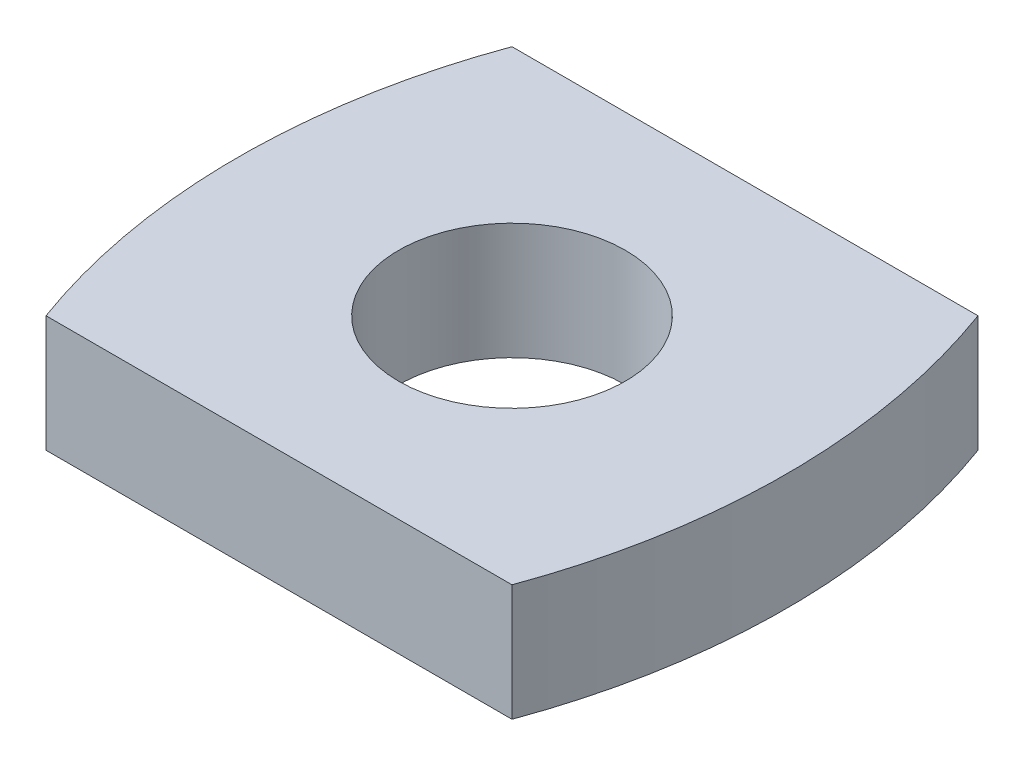
ISO-10303-21;
HEADER;
FILE_DESCRIPTION(('STEP AP214'),'2;1');
FILE_NAME('part.step','',(''),(''),'','','');
FILE_SCHEMA(('AUTOMOTIVE_DESIGN { 1 0 10303 214 1 1 1 1 }'));
ENDSEC;
DATA;
#1=APPLICATION_CONTEXT('core data for automotive mechanical design processes');
#2=APPLICATION_PROTOCOL_DEFINITION('international standard','automotive_design',2000,#1);
#3=PRODUCT_CONTEXT('',#1,'mechanical');
#4=PRODUCT('Part','Part','',(#3));
#5=PRODUCT_RELATED_PRODUCT_CATEGORY('part','',(#4));
#6=PRODUCT_DEFINITION_FORMATION('','',#4);
#7=PRODUCT_DEFINITION_CONTEXT('part definition',#1,'design');
#8=PRODUCT_DEFINITION('design','',#6,#7);
#9=PRODUCT_DEFINITION_SHAPE('','',#8);
#10=(LENGTH_UNIT() NAMED_UNIT(*) SI_UNIT(.MILLI.,.METRE.));
#11=(NAMED_UNIT(*) PLANE_ANGLE_UNIT() SI_UNIT($,.RADIAN.));
#12=(NAMED_UNIT(*) SI_UNIT($,.STERADIAN.) SOLID_ANGLE_UNIT());
#13=UNCERTAINTY_MEASURE_WITH_UNIT(LENGTH_MEASURE(1.E-05),#10,'distance_accuracy_value','');
#14=(GEOMETRIC_REPRESENTATION_CONTEXT(3) GLOBAL_UNCERTAINTY_ASSIGNED_CONTEXT((#13)) GLOBAL_UNIT_ASSIGNED_CONTEXT((#10,
#11,#12)) REPRESENTATION_CONTEXT('',''));
#15=CARTESIAN_POINT('',(0.,0.,0.));
#16=DIRECTION('',(0.,0.,1.));
#17=DIRECTION('',(1.,0.,0.));
#18=AXIS2_PLACEMENT_3D('',#15,#16,#17);
#19=CARTESIAN_POINT('',(-17.3167200153134,5.,0.));
#20=DIRECTION('',(0.,-1.,0.));
#21=DIRECTION('',(0.,0.,-1.));
#22=AXIS2_PLACEMENT_3D('',#19,#20,#21);
#23=PLANE('',#22);
#24=CARTESIAN_POINT('',(-17.3167200153134,5.,0.));
#25=DIRECTION('',(0.,1.,0.));
#26=DIRECTION('',(0.,0.,-1.));
#27=AXIS2_PLACEMENT_3D('',#24,#25,#26);
#28=CIRCLE('',#27,29.0895718840107);
#29=CARTESIAN_POINT('',(10.,5.,10.));
#30=VERTEX_POINT('',#29);
#31=CARTESIAN_POINT('',(10.,5.,-10.));
#32=VERTEX_POINT('',#31);
#33=EDGE_CURVE('E92',#30,#32,#28,.T.);
#34=ORIENTED_EDGE('',*,*,#33,.T.);
#35=DIRECTION('',(-1.,0.,0.));
#36=VECTOR('',#35,1.);
#37=CARTESIAN_POINT('',(10.,5.,-10.));
#38=LINE('',#37,#36);
#39=CARTESIAN_POINT('',(-10.,5.,-10.));
#40=VERTEX_POINT('',#39);
#41=EDGE_CURVE('E87',#32,#40,#38,.T.);
#42=ORIENTED_EDGE('',*,*,#41,.T.);
#43=CARTESIAN_POINT('',(17.3167200153134,5.,0.));
#44=DIRECTION('',(0.,1.,0.));
#45=DIRECTION('',(0.,0.,1.));
#46=AXIS2_PLACEMENT_3D('',#43,#44,#45);
#47=CIRCLE('',#46,29.0895718840107);
#48=CARTESIAN_POINT('',(-10.,5.,10.));
#49=VERTEX_POINT('',#48);
#50=EDGE_CURVE('E90',#40,#49,#47,.T.);
#51=ORIENTED_EDGE('',*,*,#50,.T.);
#52=DIRECTION('',(1.,0.,0.));
#53=VECTOR('',#52,1.);
#54=CARTESIAN_POINT('',(-10.,5.,10.));
#55=LINE('',#54,#53);
#56=EDGE_CURVE('E57',#49,#30,#55,.T.);
#57=ORIENTED_EDGE('',*,*,#56,.T.);
#58=EDGE_LOOP('',(#34,#42,#51,#57));
#59=FACE_BOUND('',#58,.T.);
#60=CARTESIAN_POINT('',(0.,5.,0.));
#61=DIRECTION('',(0.,1.,0.));
#62=DIRECTION('',(0.,0.,1.));
#63=AXIS2_PLACEMENT_3D('',#60,#61,#62);
#64=CIRCLE('',#63,4.86704423078445);
#65=CARTESIAN_POINT('',(0.,5.,4.86704423078445));
#66=VERTEX_POINT('',#65);
#67=EDGE_CURVE('E112',#66,#66,#64,.T.);
#68=ORIENTED_EDGE('',*,*,#67,.F.);
#69=EDGE_LOOP('',(#68));
#70=FACE_BOUND('',#69,.T.);
#71=ADVANCED_FACE('F39',(#59,#70),#23,.F.);
#72=CARTESIAN_POINT('',(-17.3167200153134,0.,0.));
#73=DIRECTION('',(0.,-1.,0.));
#74=DIRECTION('',(0.,0.,-1.));
#75=AXIS2_PLACEMENT_3D('',#72,#73,#74);
#76=PLANE('',#75);
#77=CARTESIAN_POINT('',(-17.3167200153134,0.,0.));
#78=DIRECTION('',(0.,1.,0.));
#79=DIRECTION('',(0.,0.,-1.));
#80=AXIS2_PLACEMENT_3D('',#77,#78,#79);
#81=CIRCLE('',#80,29.0895718840107);
#82=CARTESIAN_POINT('',(10.,0.,10.));
#83=VERTEX_POINT('',#82);
#84=CARTESIAN_POINT('',(10.,0.,-10.));
#85=VERTEX_POINT('',#84);
#86=EDGE_CURVE('E108',#83,#85,#81,.T.);
#87=ORIENTED_EDGE('',*,*,#86,.F.);
#88=DIRECTION('',(1.,0.,0.));
#89=VECTOR('',#88,1.);
#90=CARTESIAN_POINT('',(-10.,0.,10.));
#91=LINE('',#90,#89);
#92=CARTESIAN_POINT('',(-10.,0.,10.));
#93=VERTEX_POINT('',#92);
#94=EDGE_CURVE('E80',#93,#83,#91,.T.);
#95=ORIENTED_EDGE('',*,*,#94,.F.);
#96=CARTESIAN_POINT('',(17.3167200153134,0.,0.));
#97=DIRECTION('',(0.,1.,0.));
#98=DIRECTION('',(0.,0.,1.));
#99=AXIS2_PLACEMENT_3D('',#96,#97,#98);
#100=CIRCLE('',#99,29.0895718840107);
#101=CARTESIAN_POINT('',(-10.,0.,-10.));
#102=VERTEX_POINT('',#101);
#103=EDGE_CURVE('E74',#102,#93,#100,.T.);
#104=ORIENTED_EDGE('',*,*,#103,.F.);
#105=DIRECTION('',(-1.,0.,0.));
#106=VECTOR('',#105,1.);
#107=CARTESIAN_POINT('',(10.,0.,-10.));
#108=LINE('',#107,#106);
#109=EDGE_CURVE('E97',#85,#102,#108,.T.);
#110=ORIENTED_EDGE('',*,*,#109,.F.);
#111=EDGE_LOOP('',(#87,#95,#104,#110));
#112=FACE_BOUND('',#111,.T.);
#113=CARTESIAN_POINT('',(0.,0.,0.));
#114=DIRECTION('',(0.,1.,0.));
#115=DIRECTION('',(0.,0.,1.));
#116=AXIS2_PLACEMENT_3D('',#113,#114,#115);
#117=CIRCLE('',#116,4.86704423078445);
#118=CARTESIAN_POINT('',(0.,0.,4.86704423078445));
#119=VERTEX_POINT('',#118);
#120=EDGE_CURVE('E130',#119,#119,#117,.T.);
#121=ORIENTED_EDGE('',*,*,#120,.T.);
#122=EDGE_LOOP('',(#121));
#123=FACE_BOUND('',#122,.T.);
#124=ADVANCED_FACE('F125',(#112,#123),#76,.T.);
#125=CARTESIAN_POINT('',(-17.3167200153134,5.,0.));
#126=DIRECTION('',(0.,-1.,0.));
#127=DIRECTION('',(0.,0.,-1.));
#128=AXIS2_PLACEMENT_3D('',#125,#126,#127);
#129=CYLINDRICAL_SURFACE('',#128,29.0895718840107);
#130=ORIENTED_EDGE('',*,*,#86,.T.);
#131=DIRECTION('',(0.,-1.,0.));
#132=VECTOR('',#131,1.);
#133=CARTESIAN_POINT('',(10.,5.,-10.));
#134=LINE('',#133,#132);
#135=EDGE_CURVE('E11',#32,#85,#134,.T.);
#136=ORIENTED_EDGE('',*,*,#135,.F.);
#137=ORIENTED_EDGE('',*,*,#33,.F.);
#138=DIRECTION('',(0.,-1.,0.));
#139=VECTOR('',#138,1.);
#140=CARTESIAN_POINT('',(10.,5.,10.));
#141=LINE('',#140,#139);
#142=EDGE_CURVE('E104',#30,#83,#141,.T.);
#143=ORIENTED_EDGE('',*,*,#142,.T.);
#144=EDGE_LOOP('',(#130,#136,#137,#143));
#145=FACE_BOUND('',#144,.T.);
#146=ADVANCED_FACE('F41',(#145),#129,.T.);
#147=CARTESIAN_POINT('',(10.,5.,-10.));
#148=DIRECTION('',(0.,0.,1.));
#149=DIRECTION('',(1.,0.,0.));
#150=AXIS2_PLACEMENT_3D('',#147,#148,#149);
#151=PLANE('',#150);
#152=ORIENTED_EDGE('',*,*,#109,.T.);
#153=DIRECTION('',(0.,-1.,0.));
#154=VECTOR('',#153,1.);
#155=CARTESIAN_POINT('',(-10.,5.,-10.));
#156=LINE('',#155,#154);
#157=EDGE_CURVE('E49',#40,#102,#156,.T.);
#158=ORIENTED_EDGE('',*,*,#157,.F.);
#159=ORIENTED_EDGE('',*,*,#41,.F.);
#160=ORIENTED_EDGE('',*,*,#135,.T.);
#161=EDGE_LOOP('',(#152,#158,#159,#160));
#162=FACE_BOUND('',#161,.T.);
#163=ADVANCED_FACE('F96',(#162),#151,.F.);
#164=CARTESIAN_POINT('',(17.3167200153134,5.,0.));
#165=DIRECTION('',(0.,-1.,0.));
#166=DIRECTION('',(0.,0.,-1.));
#167=AXIS2_PLACEMENT_3D('',#164,#165,#166);
#168=CYLINDRICAL_SURFACE('',#167,29.0895718840107);
#169=ORIENTED_EDGE('',*,*,#103,.T.);
#170=DIRECTION('',(0.,-1.,0.));
#171=VECTOR('',#170,1.);
#172=CARTESIAN_POINT('',(-10.,5.,10.));
#173=LINE('',#172,#171);
#174=EDGE_CURVE('E99',#49,#93,#173,.T.);
#175=ORIENTED_EDGE('',*,*,#174,.F.);
#176=ORIENTED_EDGE('',*,*,#50,.F.);
#177=ORIENTED_EDGE('',*,*,#157,.T.);
#178=EDGE_LOOP('',(#169,#175,#176,#177));
#179=FACE_BOUND('',#178,.T.);
#180=ADVANCED_FACE('F100',(#179),#168,.T.);
#181=CARTESIAN_POINT('',(-10.,5.,10.));
#182=DIRECTION('',(0.,0.,-1.));
#183=DIRECTION('',(-1.,0.,0.));
#184=AXIS2_PLACEMENT_3D('',#181,#182,#183);
#185=PLANE('',#184);
#186=ORIENTED_EDGE('',*,*,#94,.T.);
#187=ORIENTED_EDGE('',*,*,#142,.F.);
#188=ORIENTED_EDGE('',*,*,#56,.F.);
#189=ORIENTED_EDGE('',*,*,#174,.T.);
#190=EDGE_LOOP('',(#186,#187,#188,#189));
#191=FACE_BOUND('',#190,.T.);
#192=ADVANCED_FACE('F122',(#191),#185,.F.);
#193=CARTESIAN_POINT('',(0.,5.,0.));
#194=DIRECTION('',(0.,-1.,0.));
#195=DIRECTION('',(0.,0.,-1.));
#196=AXIS2_PLACEMENT_3D('',#193,#194,#195);
#197=CYLINDRICAL_SURFACE('',#196,4.86704423078445);
#198=ORIENTED_EDGE('',*,*,#67,.T.);
#199=EDGE_LOOP('',(#198));
#200=FACE_BOUND('',#199,.T.);
#201=ORIENTED_EDGE('',*,*,#120,.F.);
#202=EDGE_LOOP('',(#201));
#203=FACE_BOUND('',#202,.T.);
#204=ADVANCED_FACE('F138',(#200,#203),#197,.F.);
#205=CLOSED_SHELL('',(#71,#124,#146,#163,#180,#192,#204));
#206=MANIFOLD_SOLID_BREP('B2',#205);
#207=ADVANCED_BREP_SHAPE_REPRESENTATION('',(#18,#206),#14);
#208=SHAPE_DEFINITION_REPRESENTATION(#9,#207);
ENDSEC;
END-ISO-10303-21;
